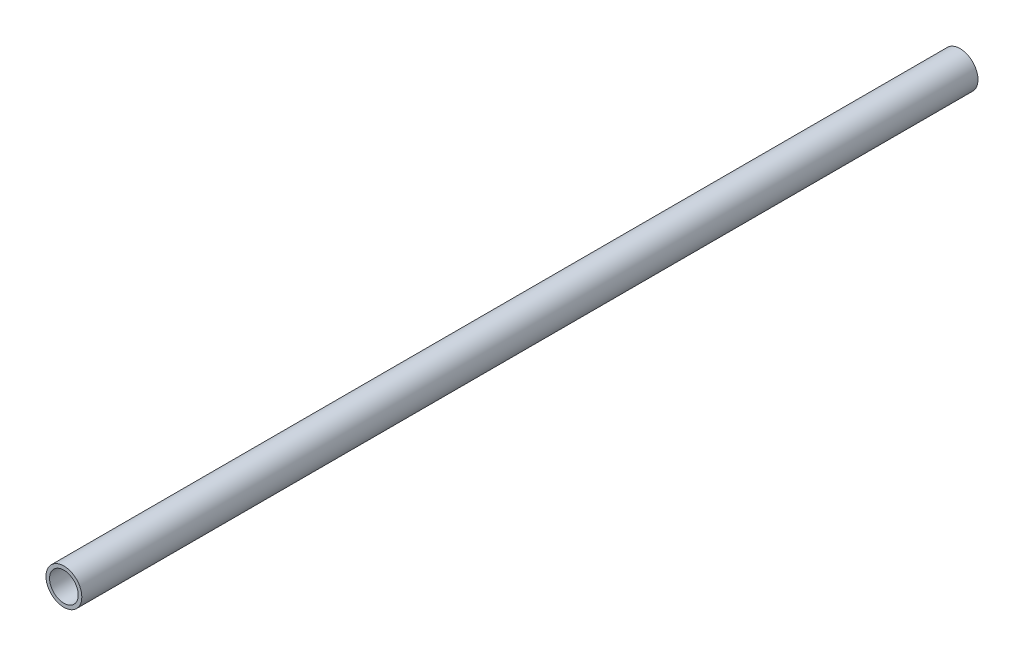
ISO-10303-21;
HEADER;
FILE_DESCRIPTION(('STEP AP214'),'2;1');
FILE_NAME('part.step','',(''),(''),'','','');
FILE_SCHEMA(('AUTOMOTIVE_DESIGN { 1 0 10303 214 1 1 1 1 }'));
ENDSEC;
DATA;
#1=APPLICATION_CONTEXT('core data for automotive mechanical design processes');
#2=APPLICATION_PROTOCOL_DEFINITION('international standard','automotive_design',2000,#1);
#3=PRODUCT_CONTEXT('',#1,'mechanical');
#4=PRODUCT('Part','Part','',(#3));
#5=PRODUCT_RELATED_PRODUCT_CATEGORY('part','',(#4));
#6=PRODUCT_DEFINITION_FORMATION('','',#4);
#7=PRODUCT_DEFINITION_CONTEXT('part definition',#1,'design');
#8=PRODUCT_DEFINITION('design','',#6,#7);
#9=PRODUCT_DEFINITION_SHAPE('','',#8);
#10=(LENGTH_UNIT() NAMED_UNIT(*) SI_UNIT(.MILLI.,.METRE.));
#11=(NAMED_UNIT(*) PLANE_ANGLE_UNIT() SI_UNIT($,.RADIAN.));
#12=(NAMED_UNIT(*) SI_UNIT($,.STERADIAN.) SOLID_ANGLE_UNIT());
#13=UNCERTAINTY_MEASURE_WITH_UNIT(LENGTH_MEASURE(1.E-05),#10,'distance_accuracy_value','');
#14=(GEOMETRIC_REPRESENTATION_CONTEXT(3) GLOBAL_UNCERTAINTY_ASSIGNED_CONTEXT((#13)) GLOBAL_UNIT_ASSIGNED_CONTEXT((#10,
#11,#12)) REPRESENTATION_CONTEXT('',''));
#15=CARTESIAN_POINT('',(0.,0.,0.));
#16=DIRECTION('',(0.,0.,1.));
#17=DIRECTION('',(1.,0.,0.));
#18=AXIS2_PLACEMENT_3D('',#15,#16,#17);
#19=CARTESIAN_POINT('',(0.,0.,250.));
#20=DIRECTION('',(0.,0.,1.));
#21=DIRECTION('',(1.,0.,0.));
#22=AXIS2_PLACEMENT_3D('',#19,#20,#21);
#23=PLANE('',#22);
#24=CARTESIAN_POINT('',(0.,0.,250.));
#25=DIRECTION('',(0.,0.,1.));
#26=DIRECTION('',(1.,0.,0.));
#27=AXIS2_PLACEMENT_3D('',#24,#25,#26);
#28=CIRCLE('',#27,5.);
#29=CARTESIAN_POINT('',(5.,0.,250.));
#30=VERTEX_POINT('',#29);
#31=EDGE_CURVE('E10',#30,#30,#28,.T.);
#32=ORIENTED_EDGE('',*,*,#31,.T.);
#33=EDGE_LOOP('',(#32));
#34=FACE_BOUND('',#33,.T.);
#35=CARTESIAN_POINT('',(0.,0.,250.));
#36=DIRECTION('',(0.,0.,1.));
#37=DIRECTION('',(1.,0.,0.));
#38=AXIS2_PLACEMENT_3D('',#35,#36,#37);
#39=CIRCLE('',#38,4.);
#40=CARTESIAN_POINT('',(4.,0.,250.));
#41=VERTEX_POINT('',#40);
#42=EDGE_CURVE('E52',#41,#41,#39,.T.);
#43=ORIENTED_EDGE('',*,*,#42,.F.);
#44=EDGE_LOOP('',(#43));
#45=FACE_BOUND('',#44,.T.);
#46=ADVANCED_FACE('F39',(#34,#45),#23,.T.);
#47=CARTESIAN_POINT('',(0.,0.,0.));
#48=DIRECTION('',(0.,0.,1.));
#49=DIRECTION('',(1.,0.,0.));
#50=AXIS2_PLACEMENT_3D('',#47,#48,#49);
#51=PLANE('',#50);
#52=CARTESIAN_POINT('',(0.,0.,0.));
#53=DIRECTION('',(0.,0.,1.));
#54=DIRECTION('',(1.,0.,0.));
#55=AXIS2_PLACEMENT_3D('',#52,#53,#54);
#56=CIRCLE('',#55,5.);
#57=CARTESIAN_POINT('',(5.,0.,0.));
#58=VERTEX_POINT('',#57);
#59=EDGE_CURVE('E43',#58,#58,#56,.T.);
#60=ORIENTED_EDGE('',*,*,#59,.F.);
#61=EDGE_LOOP('',(#60));
#62=FACE_BOUND('',#61,.T.);
#63=CARTESIAN_POINT('',(0.,0.,0.));
#64=DIRECTION('',(0.,0.,1.));
#65=DIRECTION('',(1.,0.,0.));
#66=AXIS2_PLACEMENT_3D('',#63,#64,#65);
#67=CIRCLE('',#66,4.);
#68=CARTESIAN_POINT('',(4.,0.,0.));
#69=VERTEX_POINT('',#68);
#70=EDGE_CURVE('E54',#69,#69,#67,.T.);
#71=ORIENTED_EDGE('',*,*,#70,.T.);
#72=EDGE_LOOP('',(#71));
#73=FACE_BOUND('',#72,.T.);
#74=ADVANCED_FACE('F66',(#62,#73),#51,.F.);
#75=CARTESIAN_POINT('',(0.,0.,250.));
#76=DIRECTION('',(0.,0.,-1.));
#77=DIRECTION('',(-1.,0.,0.));
#78=AXIS2_PLACEMENT_3D('',#75,#76,#77);
#79=CYLINDRICAL_SURFACE('',#78,5.);
#80=ORIENTED_EDGE('',*,*,#31,.F.);
#81=EDGE_LOOP('',(#80));
#82=FACE_BOUND('',#81,.T.);
#83=ORIENTED_EDGE('',*,*,#59,.T.);
#84=EDGE_LOOP('',(#83));
#85=FACE_BOUND('',#84,.T.);
#86=ADVANCED_FACE('F41',(#82,#85),#79,.T.);
#87=CARTESIAN_POINT('',(0.,0.,250.));
#88=DIRECTION('',(0.,0.,-1.));
#89=DIRECTION('',(-1.,0.,0.));
#90=AXIS2_PLACEMENT_3D('',#87,#88,#89);
#91=CYLINDRICAL_SURFACE('',#90,4.);
#92=ORIENTED_EDGE('',*,*,#42,.T.);
#93=EDGE_LOOP('',(#92));
#94=FACE_BOUND('',#93,.T.);
#95=ORIENTED_EDGE('',*,*,#70,.F.);
#96=EDGE_LOOP('',(#95));
#97=FACE_BOUND('',#96,.T.);
#98=ADVANCED_FACE('F62',(#94,#97),#91,.F.);
#99=CLOSED_SHELL('',(#46,#74,#86,#98));
#100=MANIFOLD_SOLID_BREP('B2',#99);
#101=ADVANCED_BREP_SHAPE_REPRESENTATION('',(#18,#100),#14);
#102=SHAPE_DEFINITION_REPRESENTATION(#9,#101);
ENDSEC;
END-ISO-10303-21;
